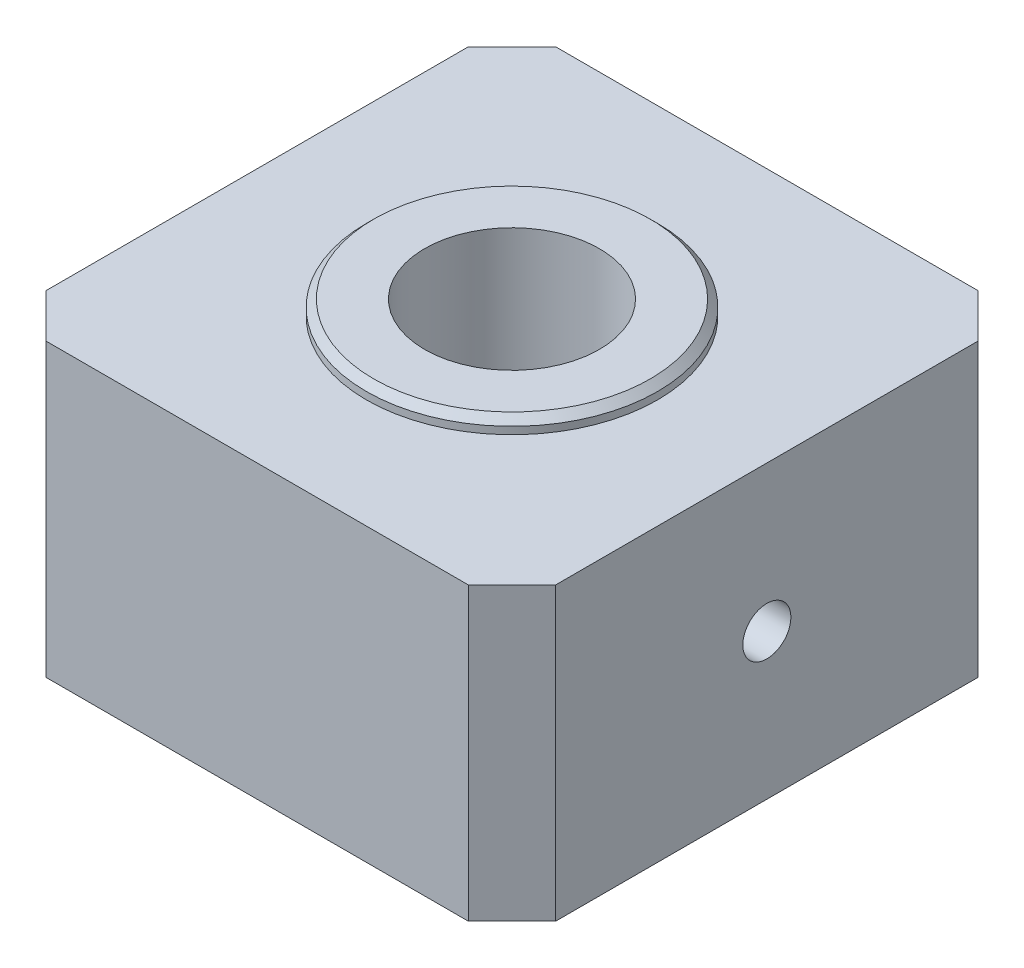
ISO-10303-21;
HEADER;
FILE_DESCRIPTION(('STEP AP214'),'2;1');
FILE_NAME('part.step','',(''),(''),'','','');
FILE_SCHEMA(('AUTOMOTIVE_DESIGN { 1 0 10303 214 1 1 1 1 }'));
ENDSEC;
DATA;
#1=APPLICATION_CONTEXT('core data for automotive mechanical design processes');
#2=APPLICATION_PROTOCOL_DEFINITION('international standard','automotive_design',2000,#1);
#3=PRODUCT_CONTEXT('',#1,'mechanical');
#4=PRODUCT('Part','Part','',(#3));
#5=PRODUCT_RELATED_PRODUCT_CATEGORY('part','',(#4));
#6=PRODUCT_DEFINITION_FORMATION('','',#4);
#7=PRODUCT_DEFINITION_CONTEXT('part definition',#1,'design');
#8=PRODUCT_DEFINITION('design','',#6,#7);
#9=PRODUCT_DEFINITION_SHAPE('','',#8);
#10=(LENGTH_UNIT() NAMED_UNIT(*) SI_UNIT(.MILLI.,.METRE.));
#11=(NAMED_UNIT(*) PLANE_ANGLE_UNIT() SI_UNIT($,.RADIAN.));
#12=(NAMED_UNIT(*) SI_UNIT($,.STERADIAN.) SOLID_ANGLE_UNIT());
#13=UNCERTAINTY_MEASURE_WITH_UNIT(LENGTH_MEASURE(1.E-05),#10,'distance_accuracy_value','');
#14=(GEOMETRIC_REPRESENTATION_CONTEXT(3) GLOBAL_UNCERTAINTY_ASSIGNED_CONTEXT((#13)) GLOBAL_UNIT_ASSIGNED_CONTEXT((#10,
#11,#12)) REPRESENTATION_CONTEXT('',''));
#15=CARTESIAN_POINT('',(0.,0.,0.));
#16=DIRECTION('',(0.,0.,1.));
#17=DIRECTION('',(1.,0.,0.));
#18=AXIS2_PLACEMENT_3D('',#15,#16,#17);
#19=CARTESIAN_POINT('',(-17.5,20.,17.5));
#20=DIRECTION('',(1.,0.,0.));
#21=DIRECTION('',(0.,0.,-1.));
#22=AXIS2_PLACEMENT_3D('',#19,#20,#21);
#23=PLANE('',#22);
#24=DIRECTION('',(0.,0.,1.));
#25=VECTOR('',#24,1.);
#26=CARTESIAN_POINT('',(-17.5,20.,17.5));
#27=LINE('',#26,#25);
#28=CARTESIAN_POINT('',(-17.5,20.,-14.5));
#29=VERTEX_POINT('',#28);
#30=CARTESIAN_POINT('',(-17.5,20.,14.5));
#31=VERTEX_POINT('',#30);
#32=EDGE_CURVE('E200',#29,#31,#27,.T.);
#33=ORIENTED_EDGE('',*,*,#32,.F.);
#34=DIRECTION('',(0.,-1.,0.));
#35=VECTOR('',#34,1.);
#36=CARTESIAN_POINT('',(-17.5,20.,-14.5));
#37=LINE('',#36,#35);
#38=CARTESIAN_POINT('',(-17.5,0.,-14.5));
#39=VERTEX_POINT('',#38);
#40=EDGE_CURVE('E229',#29,#39,#37,.T.);
#41=ORIENTED_EDGE('',*,*,#40,.T.);
#42=DIRECTION('',(0.,0.,1.));
#43=VECTOR('',#42,1.);
#44=CARTESIAN_POINT('',(-17.5,0.,17.5));
#45=LINE('',#44,#43);
#46=CARTESIAN_POINT('',(-17.5,0.,14.5));
#47=VERTEX_POINT('',#46);
#48=EDGE_CURVE('E193',#39,#47,#45,.T.);
#49=ORIENTED_EDGE('',*,*,#48,.T.);
#50=DIRECTION('',(0.,1.,0.));
#51=VECTOR('',#50,1.);
#52=CARTESIAN_POINT('',(-17.5,20.,14.5));
#53=LINE('',#52,#51);
#54=EDGE_CURVE('E198',#47,#31,#53,.T.);
#55=ORIENTED_EDGE('',*,*,#54,.T.);
#56=EDGE_LOOP('',(#33,#41,#49,#55));
#57=FACE_BOUND('',#56,.T.);
#58=ADVANCED_FACE('F51',(#57),#23,.F.);
#59=CARTESIAN_POINT('',(17.5,20.,17.5));
#60=DIRECTION('',(0.,0.,-1.));
#61=DIRECTION('',(-1.,0.,0.));
#62=AXIS2_PLACEMENT_3D('',#59,#60,#61);
#63=PLANE('',#62);
#64=DIRECTION('',(1.,0.,0.));
#65=VECTOR('',#64,1.);
#66=CARTESIAN_POINT('',(17.5,20.,17.5));
#67=LINE('',#66,#65);
#68=CARTESIAN_POINT('',(-14.5,20.,17.5));
#69=VERTEX_POINT('',#68);
#70=CARTESIAN_POINT('',(14.5,20.,17.5));
#71=VERTEX_POINT('',#70);
#72=EDGE_CURVE('E204',#69,#71,#67,.T.);
#73=ORIENTED_EDGE('',*,*,#72,.F.);
#74=DIRECTION('',(0.,-1.,0.));
#75=VECTOR('',#74,1.);
#76=CARTESIAN_POINT('',(-14.5,20.,17.5));
#77=LINE('',#76,#75);
#78=CARTESIAN_POINT('',(-14.5,0.,17.5));
#79=VERTEX_POINT('',#78);
#80=EDGE_CURVE('E266',#69,#79,#77,.T.);
#81=ORIENTED_EDGE('',*,*,#80,.T.);
#82=DIRECTION('',(1.,0.,0.));
#83=VECTOR('',#82,1.);
#84=CARTESIAN_POINT('',(17.5,0.,17.5));
#85=LINE('',#84,#83);
#86=CARTESIAN_POINT('',(14.5,0.,17.5));
#87=VERTEX_POINT('',#86);
#88=EDGE_CURVE('E217',#79,#87,#85,.T.);
#89=ORIENTED_EDGE('',*,*,#88,.T.);
#90=DIRECTION('',(0.,1.,0.));
#91=VECTOR('',#90,1.);
#92=CARTESIAN_POINT('',(14.5,20.,17.5));
#93=LINE('',#92,#91);
#94=EDGE_CURVE('E263',#87,#71,#93,.T.);
#95=ORIENTED_EDGE('',*,*,#94,.T.);
#96=EDGE_LOOP('',(#73,#81,#89,#95));
#97=FACE_BOUND('',#96,.T.);
#98=ADVANCED_FACE('F292',(#97),#63,.F.);
#99=CARTESIAN_POINT('',(17.5,20.,17.5));
#100=DIRECTION('',(-1.,0.,0.));
#101=DIRECTION('',(0.,0.,1.));
#102=AXIS2_PLACEMENT_3D('',#99,#100,#101);
#103=PLANE('',#102);
#104=CARTESIAN_POINT('',(17.5,10.,0.));
#105=DIRECTION('',(1.,0.,0.));
#106=DIRECTION('',(0.,0.,-1.));
#107=AXIS2_PLACEMENT_3D('',#104,#105,#106);
#108=CIRCLE('',#107,1.64999999999999);
#109=CARTESIAN_POINT('',(17.5,10.,-1.64999999999999));
#110=VERTEX_POINT('',#109);
#111=EDGE_CURVE('E148',#110,#110,#108,.T.);
#112=ORIENTED_EDGE('',*,*,#111,.F.);
#113=EDGE_LOOP('',(#112));
#114=FACE_BOUND('',#113,.T.);
#115=DIRECTION('',(0.,0.,-1.));
#116=VECTOR('',#115,1.);
#117=CARTESIAN_POINT('',(17.5,20.,17.5));
#118=LINE('',#117,#116);
#119=CARTESIAN_POINT('',(17.5,20.,14.5));
#120=VERTEX_POINT('',#119);
#121=CARTESIAN_POINT('',(17.5,20.,-14.5));
#122=VERTEX_POINT('',#121);
#123=EDGE_CURVE('E208',#120,#122,#118,.T.);
#124=ORIENTED_EDGE('',*,*,#123,.F.);
#125=DIRECTION('',(0.,-1.,0.));
#126=VECTOR('',#125,1.);
#127=CARTESIAN_POINT('',(17.5,20.,14.5));
#128=LINE('',#127,#126);
#129=CARTESIAN_POINT('',(17.5,0.,14.5));
#130=VERTEX_POINT('',#129);
#131=EDGE_CURVE('E272',#120,#130,#128,.T.);
#132=ORIENTED_EDGE('',*,*,#131,.T.);
#133=DIRECTION('',(0.,0.,-1.));
#134=VECTOR('',#133,1.);
#135=CARTESIAN_POINT('',(17.5,0.,17.5));
#136=LINE('',#135,#134);
#137=CARTESIAN_POINT('',(17.5,0.,-14.5));
#138=VERTEX_POINT('',#137);
#139=EDGE_CURVE('E221',#130,#138,#136,.T.);
#140=ORIENTED_EDGE('',*,*,#139,.T.);
#141=DIRECTION('',(0.,1.,0.));
#142=VECTOR('',#141,1.);
#143=CARTESIAN_POINT('',(17.5,20.,-14.5));
#144=LINE('',#143,#142);
#145=EDGE_CURVE('E68',#138,#122,#144,.T.);
#146=ORIENTED_EDGE('',*,*,#145,.T.);
#147=EDGE_LOOP('',(#124,#132,#140,#146));
#148=FACE_BOUND('',#147,.T.);
#149=ADVANCED_FACE('F298',(#114,#148),#103,.F.);
#150=CARTESIAN_POINT('',(17.5,20.,-17.5));
#151=DIRECTION('',(0.,0.,1.));
#152=DIRECTION('',(1.,0.,0.));
#153=AXIS2_PLACEMENT_3D('',#150,#151,#152);
#154=PLANE('',#153);
#155=DIRECTION('',(-1.,0.,0.));
#156=VECTOR('',#155,1.);
#157=CARTESIAN_POINT('',(17.5,0.,-17.5));
#158=LINE('',#157,#156);
#159=CARTESIAN_POINT('',(14.5,0.,-17.5));
#160=VERTEX_POINT('',#159);
#161=CARTESIAN_POINT('',(-14.5,0.,-17.5));
#162=VERTEX_POINT('',#161);
#163=EDGE_CURVE('E205',#160,#162,#158,.T.);
#164=ORIENTED_EDGE('',*,*,#163,.T.);
#165=DIRECTION('',(0.,1.,0.));
#166=VECTOR('',#165,1.);
#167=CARTESIAN_POINT('',(-14.5,20.,-17.5));
#168=LINE('',#167,#166);
#169=CARTESIAN_POINT('',(-14.5,20.,-17.5));
#170=VERTEX_POINT('',#169);
#171=EDGE_CURVE('E249',#162,#170,#168,.T.);
#172=ORIENTED_EDGE('',*,*,#171,.T.);
#173=DIRECTION('',(-1.,0.,0.));
#174=VECTOR('',#173,1.);
#175=CARTESIAN_POINT('',(17.5,20.,-17.5));
#176=LINE('',#175,#174);
#177=CARTESIAN_POINT('',(14.5,20.,-17.5));
#178=VERTEX_POINT('',#177);
#179=EDGE_CURVE('E199',#178,#170,#176,.T.);
#180=ORIENTED_EDGE('',*,*,#179,.F.);
#181=DIRECTION('',(0.,-1.,0.));
#182=VECTOR('',#181,1.);
#183=CARTESIAN_POINT('',(14.5,20.,-17.5));
#184=LINE('',#183,#182);
#185=EDGE_CURVE('E245',#178,#160,#184,.T.);
#186=ORIENTED_EDGE('',*,*,#185,.T.);
#187=EDGE_LOOP('',(#164,#172,#180,#186));
#188=FACE_BOUND('',#187,.T.);
#189=ADVANCED_FACE('F342',(#188),#154,.F.);
#190=CARTESIAN_POINT('',(0.,20.,0.));
#191=DIRECTION('',(0.,1.,0.));
#192=DIRECTION('',(0.,0.,1.));
#193=AXIS2_PLACEMENT_3D('',#190,#191,#192);
#194=PLANE('',#193);
#195=CARTESIAN_POINT('',(0.,20.,0.));
#196=DIRECTION('',(0.,1.,0.));
#197=DIRECTION('',(0.,0.,1.));
#198=AXIS2_PLACEMENT_3D('',#195,#196,#197);
#199=CIRCLE('',#198,10.);
#200=CARTESIAN_POINT('',(0.,20.,10.));
#201=VERTEX_POINT('',#200);
#202=EDGE_CURVE('E194',#201,#201,#199,.T.);
#203=ORIENTED_EDGE('',*,*,#202,.F.);
#204=EDGE_LOOP('',(#203));
#205=FACE_BOUND('',#204,.T.);
#206=ORIENTED_EDGE('',*,*,#179,.T.);
#207=DIRECTION('',(0.707106781186549,0.,-0.707106781186546));
#208=VECTOR('',#207,1.);
#209=CARTESIAN_POINT('',(-16.,20.,-16.));
#210=LINE('',#209,#208);
#211=EDGE_CURVE('E260',#170,#29,#210,.F.);
#212=ORIENTED_EDGE('',*,*,#211,.T.);
#213=ORIENTED_EDGE('',*,*,#32,.T.);
#214=DIRECTION('',(-0.707106781186546,0.,-0.707106781186549));
#215=VECTOR('',#214,1.);
#216=CARTESIAN_POINT('',(-16.,20.,16.));
#217=LINE('',#216,#215);
#218=EDGE_CURVE('E257',#31,#69,#217,.F.);
#219=ORIENTED_EDGE('',*,*,#218,.T.);
#220=ORIENTED_EDGE('',*,*,#72,.T.);
#221=DIRECTION('',(-0.707106781186549,0.,0.707106781186546));
#222=VECTOR('',#221,1.);
#223=CARTESIAN_POINT('',(16.,20.,16.));
#224=LINE('',#223,#222);
#225=EDGE_CURVE('E75',#71,#120,#224,.F.);
#226=ORIENTED_EDGE('',*,*,#225,.T.);
#227=ORIENTED_EDGE('',*,*,#123,.T.);
#228=DIRECTION('',(0.707106781186546,0.,0.707106781186549));
#229=VECTOR('',#228,1.);
#230=CARTESIAN_POINT('',(16.,20.,-16.));
#231=LINE('',#230,#229);
#232=EDGE_CURVE('E252',#122,#178,#231,.F.);
#233=ORIENTED_EDGE('',*,*,#232,.T.);
#234=EDGE_LOOP('',(#206,#212,#213,#219,#220,#226,#227,#233));
#235=FACE_BOUND('',#234,.T.);
#236=ADVANCED_FACE('F345',(#205,#235),#194,.T.);
#237=CARTESIAN_POINT('',(0.,0.,0.));
#238=DIRECTION('',(0.,1.,0.));
#239=DIRECTION('',(0.,0.,1.));
#240=AXIS2_PLACEMENT_3D('',#237,#238,#239);
#241=PLANE('',#240);
#242=CARTESIAN_POINT('',(12.5,0.,-12.5));
#243=DIRECTION('',(0.,-1.,0.));
#244=DIRECTION('',(0.,0.,-1.));
#245=AXIS2_PLACEMENT_3D('',#242,#243,#244);
#246=CIRCLE('',#245,1.65);
#247=CARTESIAN_POINT('',(12.5,0.,-14.15));
#248=VERTEX_POINT('',#247);
#249=EDGE_CURVE('E147',#248,#248,#246,.T.);
#250=ORIENTED_EDGE('',*,*,#249,.F.);
#251=EDGE_LOOP('',(#250));
#252=FACE_BOUND('',#251,.T.);
#253=CARTESIAN_POINT('',(12.5,0.,12.5));
#254=DIRECTION('',(0.,-1.,0.));
#255=DIRECTION('',(0.,0.,-1.));
#256=AXIS2_PLACEMENT_3D('',#253,#254,#255);
#257=CIRCLE('',#256,1.65);
#258=CARTESIAN_POINT('',(12.5,0.,10.85));
#259=VERTEX_POINT('',#258);
#260=EDGE_CURVE('E161',#259,#259,#257,.T.);
#261=ORIENTED_EDGE('',*,*,#260,.F.);
#262=EDGE_LOOP('',(#261));
#263=FACE_BOUND('',#262,.T.);
#264=CARTESIAN_POINT('',(-12.5,0.,12.5));
#265=DIRECTION('',(0.,-1.,0.));
#266=DIRECTION('',(0.,0.,-1.));
#267=AXIS2_PLACEMENT_3D('',#264,#265,#266);
#268=CIRCLE('',#267,1.65);
#269=CARTESIAN_POINT('',(-12.5,0.,10.85));
#270=VERTEX_POINT('',#269);
#271=EDGE_CURVE('E169',#270,#270,#268,.T.);
#272=ORIENTED_EDGE('',*,*,#271,.F.);
#273=EDGE_LOOP('',(#272));
#274=FACE_BOUND('',#273,.T.);
#275=CARTESIAN_POINT('',(-12.5,0.,-12.5));
#276=DIRECTION('',(0.,-1.,0.));
#277=DIRECTION('',(0.,0.,-1.));
#278=AXIS2_PLACEMENT_3D('',#275,#276,#277);
#279=CIRCLE('',#278,1.65);
#280=CARTESIAN_POINT('',(-12.5,0.,-14.15));
#281=VERTEX_POINT('',#280);
#282=EDGE_CURVE('E177',#281,#281,#279,.T.);
#283=ORIENTED_EDGE('',*,*,#282,.F.);
#284=EDGE_LOOP('',(#283));
#285=FACE_BOUND('',#284,.T.);
#286=ORIENTED_EDGE('',*,*,#48,.F.);
#287=DIRECTION('',(-0.707106781186549,0.,0.707106781186546));
#288=VECTOR('',#287,1.);
#289=CARTESIAN_POINT('',(-17.5,0.,-14.5));
#290=LINE('',#289,#288);
#291=EDGE_CURVE('E242',#39,#162,#290,.F.);
#292=ORIENTED_EDGE('',*,*,#291,.T.);
#293=ORIENTED_EDGE('',*,*,#163,.F.);
#294=DIRECTION('',(-0.707106781186546,0.,-0.707106781186549));
#295=VECTOR('',#294,1.);
#296=CARTESIAN_POINT('',(14.5,0.,-17.5));
#297=LINE('',#296,#295);
#298=EDGE_CURVE('E233',#160,#138,#297,.F.);
#299=ORIENTED_EDGE('',*,*,#298,.T.);
#300=ORIENTED_EDGE('',*,*,#139,.F.);
#301=DIRECTION('',(0.707106781186549,0.,-0.707106781186546));
#302=VECTOR('',#301,1.);
#303=CARTESIAN_POINT('',(17.5,0.,14.5));
#304=LINE('',#303,#302);
#305=EDGE_CURVE('E236',#130,#87,#304,.F.);
#306=ORIENTED_EDGE('',*,*,#305,.T.);
#307=ORIENTED_EDGE('',*,*,#88,.F.);
#308=DIRECTION('',(0.707106781186546,0.,0.707106781186549));
#309=VECTOR('',#308,1.);
#310=CARTESIAN_POINT('',(-14.5,0.,17.5));
#311=LINE('',#310,#309);
#312=EDGE_CURVE('E239',#79,#47,#311,.F.);
#313=ORIENTED_EDGE('',*,*,#312,.T.);
#314=EDGE_LOOP('',(#286,#292,#293,#299,#300,#306,#307,#313));
#315=FACE_BOUND('',#314,.T.);
#316=ADVANCED_FACE('F335',(#252,#263,#274,#285,#315),#241,.F.);
#317=CARTESIAN_POINT('',(0.,21.,0.));
#318=DIRECTION('',(0.,-1.,0.));
#319=DIRECTION('',(0.,0.,-1.));
#320=AXIS2_PLACEMENT_3D('',#317,#318,#319);
#321=CYLINDRICAL_SURFACE('',#320,10.);
#322=CARTESIAN_POINT('',(0.,20.5,0.));
#323=DIRECTION('',(0.,1.,0.));
#324=DIRECTION('',(0.,0.,1.));
#325=AXIS2_PLACEMENT_3D('',#322,#323,#324);
#326=CIRCLE('',#325,10.);
#327=CARTESIAN_POINT('',(0.,20.5,10.));
#328=VERTEX_POINT('',#327);
#329=EDGE_CURVE('E11',#328,#328,#326,.F.);
#330=ORIENTED_EDGE('',*,*,#329,.T.);
#331=EDGE_LOOP('',(#330));
#332=FACE_BOUND('',#331,.T.);
#333=ORIENTED_EDGE('',*,*,#202,.T.);
#334=EDGE_LOOP('',(#333));
#335=FACE_BOUND('',#334,.T.);
#336=ADVANCED_FACE('F358',(#332,#335),#321,.T.);
#337=CARTESIAN_POINT('',(0.,21.,0.));
#338=DIRECTION('',(0.,1.,0.));
#339=DIRECTION('',(0.,0.,1.));
#340=AXIS2_PLACEMENT_3D('',#337,#338,#339);
#341=PLANE('',#340);
#342=CARTESIAN_POINT('',(0.,21.,0.));
#343=DIRECTION('',(0.,1.,0.));
#344=DIRECTION('',(0.,0.,1.));
#345=AXIS2_PLACEMENT_3D('',#342,#343,#344);
#346=CIRCLE('',#345,9.49999999999999);
#347=CARTESIAN_POINT('',(0.,21.,9.49999999999999));
#348=VERTEX_POINT('',#347);
#349=EDGE_CURVE('E61',#348,#348,#346,.T.);
#350=ORIENTED_EDGE('',*,*,#349,.T.);
#351=EDGE_LOOP('',(#350));
#352=FACE_BOUND('',#351,.T.);
#353=CARTESIAN_POINT('',(0.,21.,0.));
#354=DIRECTION('',(0.,1.,0.));
#355=DIRECTION('',(0.,0.,1.));
#356=AXIS2_PLACEMENT_3D('',#353,#354,#355);
#357=CIRCLE('',#356,5.99999999999999);
#358=CARTESIAN_POINT('',(0.,21.,5.99999999999999));
#359=VERTEX_POINT('',#358);
#360=EDGE_CURVE('E185',#359,#359,#357,.T.);
#361=ORIENTED_EDGE('',*,*,#360,.F.);
#362=EDGE_LOOP('',(#361));
#363=FACE_BOUND('',#362,.T.);
#364=ADVANCED_FACE('F279',(#352,#363),#341,.T.);
#365=CARTESIAN_POINT('',(0.,7.,0.));
#366=DIRECTION('',(0.,1.,0.));
#367=DIRECTION('',(0.,0.,1.));
#368=AXIS2_PLACEMENT_3D('',#365,#366,#367);
#369=CONICAL_SURFACE('',#368,5.99999999999999,1.02974425867666);
#370=CARTESIAN_POINT('',(0.,3.39483628583466,0.));
#371=VERTEX_POINT('',#370);
#372=VERTEX_LOOP('',#371);
#373=FACE_BOUND('',#372,.T.);
#374=CARTESIAN_POINT('',(0.,7.,0.));
#375=DIRECTION('',(0.,1.,0.));
#376=DIRECTION('',(0.,0.,1.));
#377=AXIS2_PLACEMENT_3D('',#374,#375,#376);
#378=CIRCLE('',#377,5.99999999999999);
#379=CARTESIAN_POINT('',(0.,7.,5.99999999999999));
#380=VERTEX_POINT('',#379);
#381=EDGE_CURVE('E189',#380,#380,#378,.T.);
#382=ORIENTED_EDGE('',*,*,#381,.T.);
#383=EDGE_LOOP('',(#382));
#384=FACE_BOUND('',#383,.T.);
#385=ADVANCED_FACE('F410',(#373,#384),#369,.F.);
#386=CARTESIAN_POINT('',(0.,21.,0.));
#387=DIRECTION('',(0.,1.,0.));
#388=DIRECTION('',(0.,0.,1.));
#389=AXIS2_PLACEMENT_3D('',#386,#387,#388);
#390=CYLINDRICAL_SURFACE('',#389,5.99999999999999);
#391=ORIENTED_EDGE('',*,*,#381,.F.);
#392=EDGE_LOOP('',(#391));
#393=FACE_BOUND('',#392,.T.);
#394=ORIENTED_EDGE('',*,*,#360,.T.);
#395=EDGE_LOOP('',(#394));
#396=FACE_BOUND('',#395,.T.);
#397=ADVANCED_FACE('F406',(#393,#396),#390,.F.);
#398=CARTESIAN_POINT('',(-12.5,10.1,-12.5));
#399=DIRECTION('',(0.,-1.,0.));
#400=DIRECTION('',(0.,0.,-1.));
#401=AXIS2_PLACEMENT_3D('',#398,#399,#400);
#402=CONICAL_SURFACE('',#401,1.65,1.02974425867665);
#403=CARTESIAN_POINT('',(-12.5,11.0914200213955,-12.5));
#404=VERTEX_POINT('',#403);
#405=VERTEX_LOOP('',#404);
#406=FACE_BOUND('',#405,.T.);
#407=CARTESIAN_POINT('',(-12.5,10.1,-12.5));
#408=DIRECTION('',(0.,-1.,0.));
#409=DIRECTION('',(0.,0.,-1.));
#410=AXIS2_PLACEMENT_3D('',#407,#408,#409);
#411=CIRCLE('',#410,1.65);
#412=CARTESIAN_POINT('',(-12.5,10.1,-14.15));
#413=VERTEX_POINT('',#412);
#414=EDGE_CURVE('E181',#413,#413,#411,.T.);
#415=ORIENTED_EDGE('',*,*,#414,.T.);
#416=EDGE_LOOP('',(#415));
#417=FACE_BOUND('',#416,.T.);
#418=ADVANCED_FACE('F402',(#406,#417),#402,.F.);
#419=CARTESIAN_POINT('',(-12.5,0.,-12.5));
#420=DIRECTION('',(0.,-1.,0.));
#421=DIRECTION('',(0.,0.,-1.));
#422=AXIS2_PLACEMENT_3D('',#419,#420,#421);
#423=CYLINDRICAL_SURFACE('',#422,1.65);
#424=ORIENTED_EDGE('',*,*,#414,.F.);
#425=EDGE_LOOP('',(#424));
#426=FACE_BOUND('',#425,.T.);
#427=ORIENTED_EDGE('',*,*,#282,.T.);
#428=EDGE_LOOP('',(#427));
#429=FACE_BOUND('',#428,.T.);
#430=ADVANCED_FACE('F398',(#426,#429),#423,.F.);
#431=CARTESIAN_POINT('',(-12.5,10.1,12.5));
#432=DIRECTION('',(0.,-1.,0.));
#433=DIRECTION('',(0.,0.,-1.));
#434=AXIS2_PLACEMENT_3D('',#431,#432,#433);
#435=CONICAL_SURFACE('',#434,1.65,1.02974425867665);
#436=CARTESIAN_POINT('',(-12.5,11.0914200213955,12.5));
#437=VERTEX_POINT('',#436);
#438=VERTEX_LOOP('',#437);
#439=FACE_BOUND('',#438,.T.);
#440=CARTESIAN_POINT('',(-12.5,10.1,12.5));
#441=DIRECTION('',(0.,-1.,0.));
#442=DIRECTION('',(0.,0.,-1.));
#443=AXIS2_PLACEMENT_3D('',#440,#441,#442);
#444=CIRCLE('',#443,1.65);
#445=CARTESIAN_POINT('',(-12.5,10.1,10.85));
#446=VERTEX_POINT('',#445);
#447=EDGE_CURVE('E173',#446,#446,#444,.T.);
#448=ORIENTED_EDGE('',*,*,#447,.T.);
#449=EDGE_LOOP('',(#448));
#450=FACE_BOUND('',#449,.T.);
#451=ADVANCED_FACE('F394',(#439,#450),#435,.F.);
#452=CARTESIAN_POINT('',(-12.5,0.,12.5));
#453=DIRECTION('',(0.,-1.,0.));
#454=DIRECTION('',(0.,0.,-1.));
#455=AXIS2_PLACEMENT_3D('',#452,#453,#454);
#456=CYLINDRICAL_SURFACE('',#455,1.65);
#457=ORIENTED_EDGE('',*,*,#447,.F.);
#458=EDGE_LOOP('',(#457));
#459=FACE_BOUND('',#458,.T.);
#460=ORIENTED_EDGE('',*,*,#271,.T.);
#461=EDGE_LOOP('',(#460));
#462=FACE_BOUND('',#461,.T.);
#463=ADVANCED_FACE('F390',(#459,#462),#456,.F.);
#464=CARTESIAN_POINT('',(12.5,10.1,12.5));
#465=DIRECTION('',(0.,-1.,0.));
#466=DIRECTION('',(0.,0.,-1.));
#467=AXIS2_PLACEMENT_3D('',#464,#465,#466);
#468=CONICAL_SURFACE('',#467,1.65,1.02974425867665);
#469=CARTESIAN_POINT('',(12.5,11.0914200213955,12.5));
#470=VERTEX_POINT('',#469);
#471=VERTEX_LOOP('',#470);
#472=FACE_BOUND('',#471,.T.);
#473=CARTESIAN_POINT('',(12.5,10.1,12.5));
#474=DIRECTION('',(0.,-1.,0.));
#475=DIRECTION('',(0.,0.,-1.));
#476=AXIS2_PLACEMENT_3D('',#473,#474,#475);
#477=CIRCLE('',#476,1.65);
#478=CARTESIAN_POINT('',(12.5,10.1,10.85));
#479=VERTEX_POINT('',#478);
#480=EDGE_CURVE('E165',#479,#479,#477,.T.);
#481=ORIENTED_EDGE('',*,*,#480,.T.);
#482=EDGE_LOOP('',(#481));
#483=FACE_BOUND('',#482,.T.);
#484=ADVANCED_FACE('F386',(#472,#483),#468,.F.);
#485=CARTESIAN_POINT('',(12.5,0.,12.5));
#486=DIRECTION('',(0.,-1.,0.));
#487=DIRECTION('',(0.,0.,-1.));
#488=AXIS2_PLACEMENT_3D('',#485,#486,#487);
#489=CYLINDRICAL_SURFACE('',#488,1.65);
#490=ORIENTED_EDGE('',*,*,#480,.F.);
#491=EDGE_LOOP('',(#490));
#492=FACE_BOUND('',#491,.T.);
#493=ORIENTED_EDGE('',*,*,#260,.T.);
#494=EDGE_LOOP('',(#493));
#495=FACE_BOUND('',#494,.T.);
#496=ADVANCED_FACE('F382',(#492,#495),#489,.F.);
#497=CARTESIAN_POINT('',(12.5,10.1,-12.5));
#498=DIRECTION('',(0.,-1.,0.));
#499=DIRECTION('',(0.,0.,-1.));
#500=AXIS2_PLACEMENT_3D('',#497,#498,#499);
#501=CONICAL_SURFACE('',#500,1.65,1.02974425867665);
#502=CARTESIAN_POINT('',(12.5,11.0914200213955,-12.5));
#503=VERTEX_POINT('',#502);
#504=VERTEX_LOOP('',#503);
#505=FACE_BOUND('',#504,.T.);
#506=CARTESIAN_POINT('',(12.5,10.1,-12.5));
#507=DIRECTION('',(0.,-1.,0.));
#508=DIRECTION('',(0.,0.,-1.));
#509=AXIS2_PLACEMENT_3D('',#506,#507,#508);
#510=CIRCLE('',#509,1.65);
#511=CARTESIAN_POINT('',(12.5,10.1,-14.15));
#512=VERTEX_POINT('',#511);
#513=EDGE_CURVE('E153',#512,#512,#510,.T.);
#514=ORIENTED_EDGE('',*,*,#513,.T.);
#515=EDGE_LOOP('',(#514));
#516=FACE_BOUND('',#515,.T.);
#517=ADVANCED_FACE('F378',(#505,#516),#501,.F.);
#518=CARTESIAN_POINT('',(12.5,0.,-12.5));
#519=DIRECTION('',(0.,-1.,0.));
#520=DIRECTION('',(0.,0.,-1.));
#521=AXIS2_PLACEMENT_3D('',#518,#519,#520);
#522=CYLINDRICAL_SURFACE('',#521,1.65);
#523=ORIENTED_EDGE('',*,*,#513,.F.);
#524=EDGE_LOOP('',(#523));
#525=FACE_BOUND('',#524,.T.);
#526=ORIENTED_EDGE('',*,*,#249,.T.);
#527=EDGE_LOOP('',(#526));
#528=FACE_BOUND('',#527,.T.);
#529=ADVANCED_FACE('F140',(#525,#528),#522,.F.);
#530=CARTESIAN_POINT('',(8.50000000000001,10.,0.));
#531=DIRECTION('',(1.,0.,0.));
#532=DIRECTION('',(0.,0.,-1.));
#533=AXIS2_PLACEMENT_3D('',#530,#531,#532);
#534=CONICAL_SURFACE('',#533,1.65,1.02974425867665);
#535=CARTESIAN_POINT('',(7.50857997860453,10.,0.));
#536=VERTEX_POINT('',#535);
#537=VERTEX_LOOP('',#536);
#538=FACE_BOUND('',#537,.T.);
#539=CARTESIAN_POINT('',(8.50000000000001,10.,0.));
#540=DIRECTION('',(1.,0.,0.));
#541=DIRECTION('',(0.,0.,-1.));
#542=AXIS2_PLACEMENT_3D('',#539,#540,#541);
#543=CIRCLE('',#542,1.65);
#544=CARTESIAN_POINT('',(8.50000000000001,10.,-1.65));
#545=VERTEX_POINT('',#544);
#546=EDGE_CURVE('E144',#545,#545,#543,.T.);
#547=ORIENTED_EDGE('',*,*,#546,.T.);
#548=EDGE_LOOP('',(#547));
#549=FACE_BOUND('',#548,.T.);
#550=ADVANCED_FACE('F136',(#538,#549),#534,.F.);
#551=CARTESIAN_POINT('',(17.5,10.,0.));
#552=DIRECTION('',(1.,0.,0.));
#553=DIRECTION('',(0.,0.,-1.));
#554=AXIS2_PLACEMENT_3D('',#551,#552,#553);
#555=CYLINDRICAL_SURFACE('',#554,1.64999999999999);
#556=ORIENTED_EDGE('',*,*,#546,.F.);
#557=EDGE_LOOP('',(#556));
#558=FACE_BOUND('',#557,.T.);
#559=ORIENTED_EDGE('',*,*,#111,.T.);
#560=EDGE_LOOP('',(#559));
#561=FACE_BOUND('',#560,.T.);
#562=ADVANCED_FACE('F139',(#558,#561),#555,.F.);
#563=CARTESIAN_POINT('',(-17.5,20.,-14.5));
#564=DIRECTION('',(0.707106781186546,0.,0.707106781186549));
#565=DIRECTION('',(0.,-1.,0.));
#566=AXIS2_PLACEMENT_3D('',#563,#564,#565);
#567=PLANE('',#566);
#568=ORIENTED_EDGE('',*,*,#211,.F.);
#569=ORIENTED_EDGE('',*,*,#171,.F.);
#570=ORIENTED_EDGE('',*,*,#291,.F.);
#571=ORIENTED_EDGE('',*,*,#40,.F.);
#572=EDGE_LOOP('',(#568,#569,#570,#571));
#573=FACE_BOUND('',#572,.T.);
#574=ADVANCED_FACE('F305',(#573),#567,.F.);
#575=CARTESIAN_POINT('',(-14.5,20.,17.5));
#576=DIRECTION('',(0.707106781186549,0.,-0.707106781186546));
#577=DIRECTION('',(0.,-1.,0.));
#578=AXIS2_PLACEMENT_3D('',#575,#576,#577);
#579=PLANE('',#578);
#580=ORIENTED_EDGE('',*,*,#218,.F.);
#581=ORIENTED_EDGE('',*,*,#54,.F.);
#582=ORIENTED_EDGE('',*,*,#312,.F.);
#583=ORIENTED_EDGE('',*,*,#80,.F.);
#584=EDGE_LOOP('',(#580,#581,#582,#583));
#585=FACE_BOUND('',#584,.T.);
#586=ADVANCED_FACE('F311',(#585),#579,.F.);
#587=CARTESIAN_POINT('',(17.5,20.,14.5));
#588=DIRECTION('',(-0.707106781186546,0.,-0.707106781186549));
#589=DIRECTION('',(0.,-1.,0.));
#590=AXIS2_PLACEMENT_3D('',#587,#588,#589);
#591=PLANE('',#590);
#592=ORIENTED_EDGE('',*,*,#225,.F.);
#593=ORIENTED_EDGE('',*,*,#94,.F.);
#594=ORIENTED_EDGE('',*,*,#305,.F.);
#595=ORIENTED_EDGE('',*,*,#131,.F.);
#596=EDGE_LOOP('',(#592,#593,#594,#595));
#597=FACE_BOUND('',#596,.T.);
#598=ADVANCED_FACE('F288',(#597),#591,.F.);
#599=CARTESIAN_POINT('',(14.5,20.,-17.5));
#600=DIRECTION('',(-0.707106781186549,0.,0.707106781186546));
#601=DIRECTION('',(0.,-1.,0.));
#602=AXIS2_PLACEMENT_3D('',#599,#600,#601);
#603=PLANE('',#602);
#604=ORIENTED_EDGE('',*,*,#232,.F.);
#605=ORIENTED_EDGE('',*,*,#145,.F.);
#606=ORIENTED_EDGE('',*,*,#298,.F.);
#607=ORIENTED_EDGE('',*,*,#185,.F.);
#608=EDGE_LOOP('',(#604,#605,#606,#607));
#609=FACE_BOUND('',#608,.T.);
#610=ADVANCED_FACE('F283',(#609),#603,.F.);
#611=CARTESIAN_POINT('',(0.,21.,0.));
#612=DIRECTION('',(0.,-1.,0.));
#613=DIRECTION('',(0.,0.,-1.));
#614=AXIS2_PLACEMENT_3D('',#611,#612,#613);
#615=CONICAL_SURFACE('',#614,9.49999999999999,0.78539816339745);
#616=ORIENTED_EDGE('',*,*,#329,.F.);
#617=EDGE_LOOP('',(#616));
#618=FACE_BOUND('',#617,.T.);
#619=ORIENTED_EDGE('',*,*,#349,.F.);
#620=EDGE_LOOP('',(#619));
#621=FACE_BOUND('',#620,.T.);
#622=ADVANCED_FACE('F54',(#618,#621),#615,.T.);
#623=CLOSED_SHELL('',(#58,#98,#149,#189,#236,#316,#336,#364,#385,#397,#418,#430,#451,#463,#484,
#496,#517,#529,#550,#562,#574,#586,#598,#610,#622));
#624=MANIFOLD_SOLID_BREP('B2',#623);
#625=ADVANCED_BREP_SHAPE_REPRESENTATION('',(#18,#624),#14);
#626=SHAPE_DEFINITION_REPRESENTATION(#9,#625);
ENDSEC;
END-ISO-10303-21;
